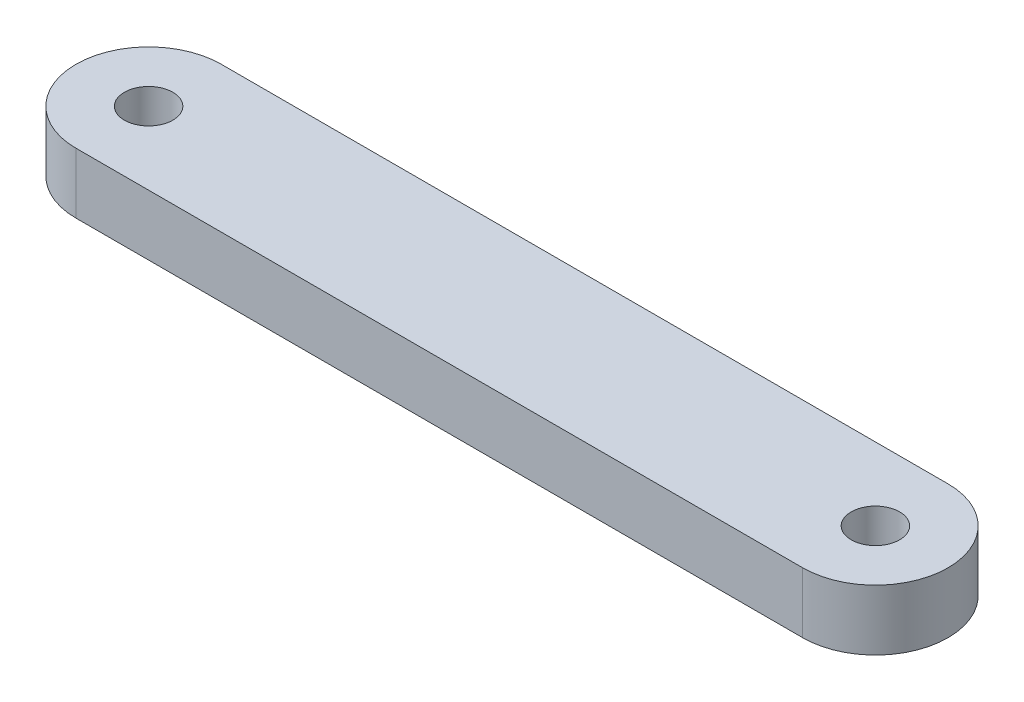
ISO-10303-21;
HEADER;
FILE_DESCRIPTION(('STEP AP214'),'2;1');
FILE_NAME('part.step','',(''),(''),'','','');
FILE_SCHEMA(('AUTOMOTIVE_DESIGN { 1 0 10303 214 1 1 1 1 }'));
ENDSEC;
DATA;
#1=APPLICATION_CONTEXT('core data for automotive mechanical design processes');
#2=APPLICATION_PROTOCOL_DEFINITION('international standard','automotive_design',2000,#1);
#3=PRODUCT_CONTEXT('',#1,'mechanical');
#4=PRODUCT('Part','Part','',(#3));
#5=PRODUCT_RELATED_PRODUCT_CATEGORY('part','',(#4));
#6=PRODUCT_DEFINITION_FORMATION('','',#4);
#7=PRODUCT_DEFINITION_CONTEXT('part definition',#1,'design');
#8=PRODUCT_DEFINITION('design','',#6,#7);
#9=PRODUCT_DEFINITION_SHAPE('','',#8);
#10=(LENGTH_UNIT() NAMED_UNIT(*) SI_UNIT(.MILLI.,.METRE.));
#11=(NAMED_UNIT(*) PLANE_ANGLE_UNIT() SI_UNIT($,.RADIAN.));
#12=(NAMED_UNIT(*) SI_UNIT($,.STERADIAN.) SOLID_ANGLE_UNIT());
#13=UNCERTAINTY_MEASURE_WITH_UNIT(LENGTH_MEASURE(1.E-05),#10,'distance_accuracy_value','');
#14=(GEOMETRIC_REPRESENTATION_CONTEXT(3) GLOBAL_UNCERTAINTY_ASSIGNED_CONTEXT((#13)) GLOBAL_UNIT_ASSIGNED_CONTEXT((#10,
#11,#12)) REPRESENTATION_CONTEXT('',''));
#15=CARTESIAN_POINT('',(0.,0.,0.));
#16=DIRECTION('',(0.,0.,1.));
#17=DIRECTION('',(1.,0.,0.));
#18=AXIS2_PLACEMENT_3D('',#15,#16,#17);
#19=CARTESIAN_POINT('',(-15.,2.5,0.));
#20=DIRECTION('',(0.,1.,0.));
#21=DIRECTION('',(0.,0.,1.));
#22=AXIS2_PLACEMENT_3D('',#19,#20,#21);
#23=PLANE('',#22);
#24=CARTESIAN_POINT('',(-15.,2.5,0.));
#25=DIRECTION('',(0.,1.,0.));
#26=DIRECTION('',(0.,0.,1.));
#27=AXIS2_PLACEMENT_3D('',#24,#25,#26);
#28=CIRCLE('',#27,1.);
#29=CARTESIAN_POINT('',(-15.,2.5,1.));
#30=VERTEX_POINT('',#29);
#31=EDGE_CURVE('E103',#30,#30,#28,.T.);
#32=ORIENTED_EDGE('',*,*,#31,.F.);
#33=EDGE_LOOP('',(#32));
#34=FACE_BOUND('',#33,.T.);
#35=CARTESIAN_POINT('',(-15.,2.5,0.));
#36=DIRECTION('',(0.,1.,0.));
#37=DIRECTION('',(0.,0.,1.));
#38=AXIS2_PLACEMENT_3D('',#35,#36,#37);
#39=CIRCLE('',#38,3.);
#40=CARTESIAN_POINT('',(-15.,2.5,-3.));
#41=VERTEX_POINT('',#40);
#42=CARTESIAN_POINT('',(-15.,2.5,3.));
#43=VERTEX_POINT('',#42);
#44=EDGE_CURVE('E88',#41,#43,#39,.T.);
#45=ORIENTED_EDGE('',*,*,#44,.T.);
#46=DIRECTION('',(1.,0.,0.));
#47=VECTOR('',#46,1.);
#48=CARTESIAN_POINT('',(-15.,2.5,3.));
#49=LINE('',#48,#47);
#50=CARTESIAN_POINT('',(15.,2.5,3.));
#51=VERTEX_POINT('',#50);
#52=EDGE_CURVE('E83',#43,#51,#49,.T.);
#53=ORIENTED_EDGE('',*,*,#52,.T.);
#54=CARTESIAN_POINT('',(15.,2.5,0.));
#55=DIRECTION('',(0.,1.,0.));
#56=DIRECTION('',(0.,0.,1.));
#57=AXIS2_PLACEMENT_3D('',#54,#55,#56);
#58=CIRCLE('',#57,3.);
#59=CARTESIAN_POINT('',(15.,2.5,-3.));
#60=VERTEX_POINT('',#59);
#61=EDGE_CURVE('E86',#51,#60,#58,.T.);
#62=ORIENTED_EDGE('',*,*,#61,.T.);
#63=DIRECTION('',(-1.,0.,0.));
#64=VECTOR('',#63,1.);
#65=CARTESIAN_POINT('',(-15.,2.5,-3.));
#66=LINE('',#65,#64);
#67=EDGE_CURVE('E53',#60,#41,#66,.T.);
#68=ORIENTED_EDGE('',*,*,#67,.T.);
#69=EDGE_LOOP('',(#45,#53,#62,#68));
#70=FACE_BOUND('',#69,.T.);
#71=CARTESIAN_POINT('',(15.,2.5,0.));
#72=DIRECTION('',(0.,1.,0.));
#73=DIRECTION('',(0.,0.,1.));
#74=AXIS2_PLACEMENT_3D('',#71,#72,#73);
#75=CIRCLE('',#74,1.);
#76=CARTESIAN_POINT('',(15.,2.5,1.));
#77=VERTEX_POINT('',#76);
#78=EDGE_CURVE('E118',#77,#77,#75,.T.);
#79=ORIENTED_EDGE('',*,*,#78,.F.);
#80=EDGE_LOOP('',(#79));
#81=FACE_BOUND('',#80,.T.);
#82=ADVANCED_FACE('F36',(#34,#70,#81),#23,.T.);
#83=CARTESIAN_POINT('',(-15.,0.,0.));
#84=DIRECTION('',(0.,1.,0.));
#85=DIRECTION('',(0.,0.,1.));
#86=AXIS2_PLACEMENT_3D('',#83,#84,#85);
#87=PLANE('',#86);
#88=CARTESIAN_POINT('',(-15.,0.,0.));
#89=DIRECTION('',(0.,1.,0.));
#90=DIRECTION('',(0.,0.,1.));
#91=AXIS2_PLACEMENT_3D('',#88,#89,#90);
#92=CIRCLE('',#91,3.);
#93=CARTESIAN_POINT('',(-15.,0.,-3.));
#94=VERTEX_POINT('',#93);
#95=CARTESIAN_POINT('',(-15.,0.,3.));
#96=VERTEX_POINT('',#95);
#97=EDGE_CURVE('E100',#94,#96,#92,.T.);
#98=ORIENTED_EDGE('',*,*,#97,.F.);
#99=DIRECTION('',(-1.,0.,0.));
#100=VECTOR('',#99,1.);
#101=CARTESIAN_POINT('',(-15.,0.,-3.));
#102=LINE('',#101,#100);
#103=CARTESIAN_POINT('',(15.,0.,-3.));
#104=VERTEX_POINT('',#103);
#105=EDGE_CURVE('E76',#104,#94,#102,.T.);
#106=ORIENTED_EDGE('',*,*,#105,.F.);
#107=CARTESIAN_POINT('',(15.,0.,0.));
#108=DIRECTION('',(0.,1.,0.));
#109=DIRECTION('',(0.,0.,1.));
#110=AXIS2_PLACEMENT_3D('',#107,#108,#109);
#111=CIRCLE('',#110,3.);
#112=CARTESIAN_POINT('',(15.,0.,3.));
#113=VERTEX_POINT('',#112);
#114=EDGE_CURVE('E70',#113,#104,#111,.T.);
#115=ORIENTED_EDGE('',*,*,#114,.F.);
#116=DIRECTION('',(1.,0.,0.));
#117=VECTOR('',#116,1.);
#118=CARTESIAN_POINT('',(-15.,0.,3.));
#119=LINE('',#118,#117);
#120=EDGE_CURVE('E92',#96,#113,#119,.T.);
#121=ORIENTED_EDGE('',*,*,#120,.F.);
#122=EDGE_LOOP('',(#98,#106,#115,#121));
#123=FACE_BOUND('',#122,.T.);
#124=CARTESIAN_POINT('',(-15.,0.,0.));
#125=DIRECTION('',(0.,1.,0.));
#126=DIRECTION('',(0.,0.,1.));
#127=AXIS2_PLACEMENT_3D('',#124,#125,#126);
#128=CIRCLE('',#127,1.);
#129=CARTESIAN_POINT('',(-15.,0.,1.));
#130=VERTEX_POINT('',#129);
#131=EDGE_CURVE('E115',#130,#130,#128,.T.);
#132=ORIENTED_EDGE('',*,*,#131,.T.);
#133=EDGE_LOOP('',(#132));
#134=FACE_BOUND('',#133,.T.);
#135=CARTESIAN_POINT('',(15.,0.,0.));
#136=DIRECTION('',(0.,1.,0.));
#137=DIRECTION('',(0.,0.,1.));
#138=AXIS2_PLACEMENT_3D('',#135,#136,#137);
#139=CIRCLE('',#138,1.);
#140=CARTESIAN_POINT('',(15.,0.,1.));
#141=VERTEX_POINT('',#140);
#142=EDGE_CURVE('E121',#141,#141,#139,.T.);
#143=ORIENTED_EDGE('',*,*,#142,.T.);
#144=EDGE_LOOP('',(#143));
#145=FACE_BOUND('',#144,.T.);
#146=ADVANCED_FACE('F111',(#123,#134,#145),#87,.F.);
#147=CARTESIAN_POINT('',(-15.,2.5,0.));
#148=DIRECTION('',(0.,-1.,0.));
#149=DIRECTION('',(0.,0.,-1.));
#150=AXIS2_PLACEMENT_3D('',#147,#148,#149);
#151=CYLINDRICAL_SURFACE('',#150,3.);
#152=ORIENTED_EDGE('',*,*,#97,.T.);
#153=DIRECTION('',(0.,-1.,0.));
#154=VECTOR('',#153,1.);
#155=CARTESIAN_POINT('',(-15.,2.5,3.));
#156=LINE('',#155,#154);
#157=EDGE_CURVE('E11',#43,#96,#156,.T.);
#158=ORIENTED_EDGE('',*,*,#157,.F.);
#159=ORIENTED_EDGE('',*,*,#44,.F.);
#160=DIRECTION('',(0.,-1.,0.));
#161=VECTOR('',#160,1.);
#162=CARTESIAN_POINT('',(-15.,2.5,-3.));
#163=LINE('',#162,#161);
#164=EDGE_CURVE('E96',#41,#94,#163,.T.);
#165=ORIENTED_EDGE('',*,*,#164,.T.);
#166=EDGE_LOOP('',(#152,#158,#159,#165));
#167=FACE_BOUND('',#166,.T.);
#168=ADVANCED_FACE('F38',(#167),#151,.T.);
#169=CARTESIAN_POINT('',(-15.,2.5,3.));
#170=DIRECTION('',(0.,0.,-1.));
#171=DIRECTION('',(-1.,0.,0.));
#172=AXIS2_PLACEMENT_3D('',#169,#170,#171);
#173=PLANE('',#172);
#174=ORIENTED_EDGE('',*,*,#120,.T.);
#175=DIRECTION('',(0.,-1.,0.));
#176=VECTOR('',#175,1.);
#177=CARTESIAN_POINT('',(15.,2.5,3.));
#178=LINE('',#177,#176);
#179=EDGE_CURVE('E45',#51,#113,#178,.T.);
#180=ORIENTED_EDGE('',*,*,#179,.F.);
#181=ORIENTED_EDGE('',*,*,#52,.F.);
#182=ORIENTED_EDGE('',*,*,#157,.T.);
#183=EDGE_LOOP('',(#174,#180,#181,#182));
#184=FACE_BOUND('',#183,.T.);
#185=ADVANCED_FACE('F91',(#184),#173,.F.);
#186=CARTESIAN_POINT('',(15.,2.5,0.));
#187=DIRECTION('',(0.,-1.,0.));
#188=DIRECTION('',(0.,0.,-1.));
#189=AXIS2_PLACEMENT_3D('',#186,#187,#188);
#190=CYLINDRICAL_SURFACE('',#189,3.);
#191=ORIENTED_EDGE('',*,*,#114,.T.);
#192=DIRECTION('',(0.,-1.,0.));
#193=VECTOR('',#192,1.);
#194=CARTESIAN_POINT('',(15.,2.5,-3.));
#195=LINE('',#194,#193);
#196=EDGE_CURVE('E93',#60,#104,#195,.T.);
#197=ORIENTED_EDGE('',*,*,#196,.F.);
#198=ORIENTED_EDGE('',*,*,#61,.F.);
#199=ORIENTED_EDGE('',*,*,#179,.T.);
#200=EDGE_LOOP('',(#191,#197,#198,#199));
#201=FACE_BOUND('',#200,.T.);
#202=ADVANCED_FACE('F94',(#201),#190,.T.);
#203=CARTESIAN_POINT('',(-15.,2.5,-3.));
#204=DIRECTION('',(0.,0.,1.));
#205=DIRECTION('',(1.,0.,0.));
#206=AXIS2_PLACEMENT_3D('',#203,#204,#205);
#207=PLANE('',#206);
#208=ORIENTED_EDGE('',*,*,#105,.T.);
#209=ORIENTED_EDGE('',*,*,#164,.F.);
#210=ORIENTED_EDGE('',*,*,#67,.F.);
#211=ORIENTED_EDGE('',*,*,#196,.T.);
#212=EDGE_LOOP('',(#208,#209,#210,#211));
#213=FACE_BOUND('',#212,.T.);
#214=ADVANCED_FACE('F108',(#213),#207,.F.);
#215=CARTESIAN_POINT('',(-15.,2.5,0.));
#216=DIRECTION('',(0.,-1.,0.));
#217=DIRECTION('',(0.,0.,-1.));
#218=AXIS2_PLACEMENT_3D('',#215,#216,#217);
#219=CYLINDRICAL_SURFACE('',#218,1.);
#220=ORIENTED_EDGE('',*,*,#31,.T.);
#221=EDGE_LOOP('',(#220));
#222=FACE_BOUND('',#221,.T.);
#223=ORIENTED_EDGE('',*,*,#131,.F.);
#224=EDGE_LOOP('',(#223));
#225=FACE_BOUND('',#224,.T.);
#226=ADVANCED_FACE('F138',(#222,#225),#219,.F.);
#227=CARTESIAN_POINT('',(15.,2.5,0.));
#228=DIRECTION('',(0.,-1.,0.));
#229=DIRECTION('',(0.,0.,-1.));
#230=AXIS2_PLACEMENT_3D('',#227,#228,#229);
#231=CYLINDRICAL_SURFACE('',#230,1.);
#232=ORIENTED_EDGE('',*,*,#78,.T.);
#233=EDGE_LOOP('',(#232));
#234=FACE_BOUND('',#233,.T.);
#235=ORIENTED_EDGE('',*,*,#142,.F.);
#236=EDGE_LOOP('',(#235));
#237=FACE_BOUND('',#236,.T.);
#238=ADVANCED_FACE('F127',(#234,#237),#231,.F.);
#239=CLOSED_SHELL('',(#82,#146,#168,#185,#202,#214,#226,#238));
#240=MANIFOLD_SOLID_BREP('B2',#239);
#241=ADVANCED_BREP_SHAPE_REPRESENTATION('',(#18,#240),#14);
#242=SHAPE_DEFINITION_REPRESENTATION(#9,#241);
ENDSEC;
END-ISO-10303-21;
